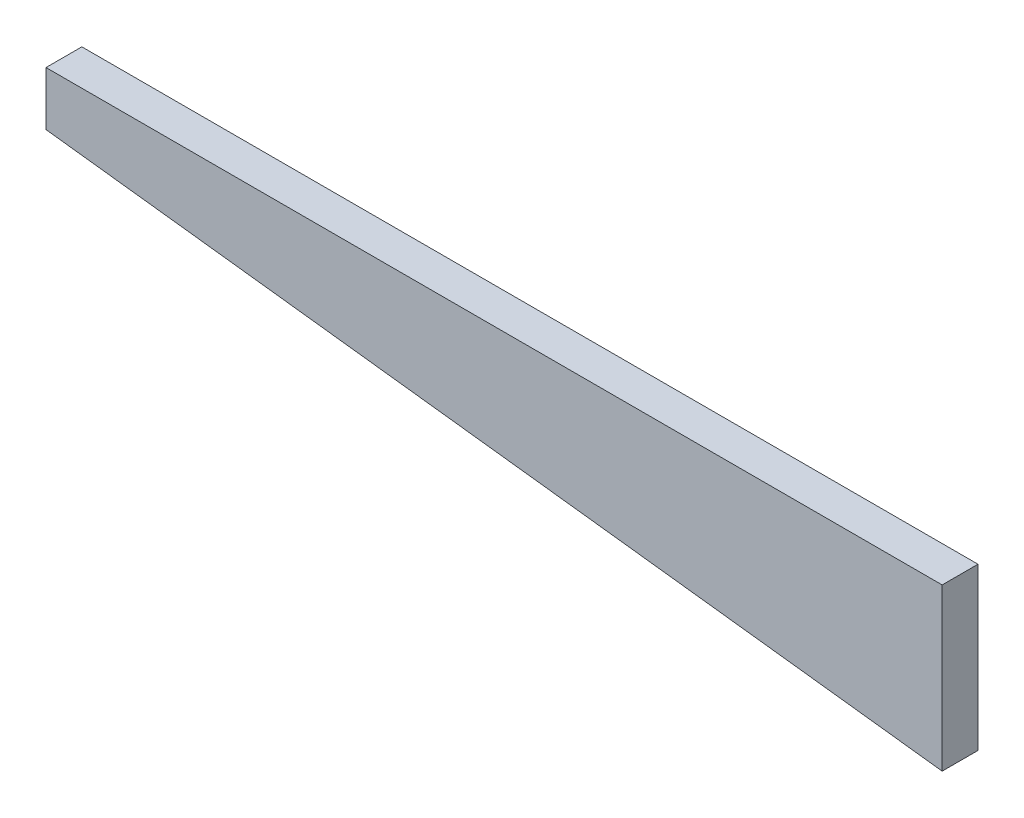
ISO-10303-21;
HEADER;
FILE_DESCRIPTION(('STEP AP214'),'2;1');
FILE_NAME('part.step','',(''),(''),'','','');
FILE_SCHEMA(('AUTOMOTIVE_DESIGN { 1 0 10303 214 1 1 1 1 }'));
ENDSEC;
DATA;
#1=APPLICATION_CONTEXT('core data for automotive mechanical design processes');
#2=APPLICATION_PROTOCOL_DEFINITION('international standard','automotive_design',2000,#1);
#3=PRODUCT_CONTEXT('',#1,'mechanical');
#4=PRODUCT('Part','Part','',(#3));
#5=PRODUCT_RELATED_PRODUCT_CATEGORY('part','',(#4));
#6=PRODUCT_DEFINITION_FORMATION('','',#4);
#7=PRODUCT_DEFINITION_CONTEXT('part definition',#1,'design');
#8=PRODUCT_DEFINITION('design','',#6,#7);
#9=PRODUCT_DEFINITION_SHAPE('','',#8);
#10=(LENGTH_UNIT() NAMED_UNIT(*) SI_UNIT(.MILLI.,.METRE.));
#11=(NAMED_UNIT(*) PLANE_ANGLE_UNIT() SI_UNIT($,.RADIAN.));
#12=(NAMED_UNIT(*) SI_UNIT($,.STERADIAN.) SOLID_ANGLE_UNIT());
#13=UNCERTAINTY_MEASURE_WITH_UNIT(LENGTH_MEASURE(1.E-05),#10,'distance_accuracy_value','');
#14=(GEOMETRIC_REPRESENTATION_CONTEXT(3) GLOBAL_UNCERTAINTY_ASSIGNED_CONTEXT((#13)) GLOBAL_UNIT_ASSIGNED_CONTEXT((#10,
#11,#12)) REPRESENTATION_CONTEXT('',''));
#15=CARTESIAN_POINT('',(0.,0.,0.));
#16=DIRECTION('',(0.,0.,1.));
#17=DIRECTION('',(1.,0.,0.));
#18=AXIS2_PLACEMENT_3D('',#15,#16,#17);
#19=CARTESIAN_POINT('',(-81.3443037974683,14.5398030942335,50.8));
#20=DIRECTION('',(-1.,0.,0.));
#21=DIRECTION('',(0.,-1.,0.));
#22=AXIS2_PLACEMENT_3D('',#19,#20,#21);
#23=PLANE('',#22);
#24=DIRECTION('',(0.,1.,0.));
#25=VECTOR('',#24,1.);
#26=CARTESIAN_POINT('',(-81.3443037974683,14.5398030942335,0.));
#27=LINE('',#26,#25);
#28=CARTESIAN_POINT('',(-81.3443037974675,-214.060196905767,0.));
#29=VERTEX_POINT('',#28);
#30=CARTESIAN_POINT('',(-81.3443037974683,14.5398030942335,0.));
#31=VERTEX_POINT('',#30);
#32=EDGE_CURVE('E105',#29,#31,#27,.T.);
#33=ORIENTED_EDGE('',*,*,#32,.T.);
#34=DIRECTION('',(0.,0.,-1.));
#35=VECTOR('',#34,1.);
#36=CARTESIAN_POINT('',(-81.3443037974683,14.5398030942335,50.8));
#37=LINE('',#36,#35);
#38=CARTESIAN_POINT('',(-81.3443037974683,14.5398030942335,50.8));
#39=VERTEX_POINT('',#38);
#40=EDGE_CURVE('E11',#39,#31,#37,.T.);
#41=ORIENTED_EDGE('',*,*,#40,.F.);
#42=DIRECTION('',(0.,1.,0.));
#43=VECTOR('',#42,1.);
#44=CARTESIAN_POINT('',(-81.3443037974683,14.5398030942335,50.8));
#45=LINE('',#44,#43);
#46=CARTESIAN_POINT('',(-81.3443037974675,-214.060196905767,50.8));
#47=VERTEX_POINT('',#46);
#48=EDGE_CURVE('E93',#47,#39,#45,.T.);
#49=ORIENTED_EDGE('',*,*,#48,.F.);
#50=DIRECTION('',(0.,0.,-1.));
#51=VECTOR('',#50,1.);
#52=CARTESIAN_POINT('',(-81.3443037974675,-214.060196905767,50.8));
#53=LINE('',#52,#51);
#54=EDGE_CURVE('E101',#47,#29,#53,.T.);
#55=ORIENTED_EDGE('',*,*,#54,.T.);
#56=EDGE_LOOP('',(#33,#41,#49,#55));
#57=FACE_BOUND('',#56,.T.);
#58=ADVANCED_FACE('F42',(#57),#23,.F.);
#59=CARTESIAN_POINT('',(-81.3443037974683,14.5398030942335,50.8));
#60=DIRECTION('',(0.,-1.,0.));
#61=DIRECTION('',(0.,0.,-1.));
#62=AXIS2_PLACEMENT_3D('',#59,#60,#61);
#63=PLANE('',#62);
#64=DIRECTION('',(-1.,0.,0.));
#65=VECTOR('',#64,1.);
#66=CARTESIAN_POINT('',(-81.3443037974683,14.5398030942335,0.));
#67=LINE('',#66,#65);
#68=CARTESIAN_POINT('',(-1351.34430379747,14.5398030942335,0.));
#69=VERTEX_POINT('',#68);
#70=EDGE_CURVE('E97',#31,#69,#67,.T.);
#71=ORIENTED_EDGE('',*,*,#70,.T.);
#72=DIRECTION('',(0.,0.,-1.));
#73=VECTOR('',#72,1.);
#74=CARTESIAN_POINT('',(-1351.34430379747,14.5398030942335,50.8));
#75=LINE('',#74,#73);
#76=CARTESIAN_POINT('',(-1351.34430379747,14.5398030942335,50.8));
#77=VERTEX_POINT('',#76);
#78=EDGE_CURVE('E50',#77,#69,#75,.T.);
#79=ORIENTED_EDGE('',*,*,#78,.F.);
#80=DIRECTION('',(-1.,0.,0.));
#81=VECTOR('',#80,1.);
#82=CARTESIAN_POINT('',(-81.3443037974683,14.5398030942335,50.8));
#83=LINE('',#82,#81);
#84=EDGE_CURVE('E88',#39,#77,#83,.T.);
#85=ORIENTED_EDGE('',*,*,#84,.F.);
#86=ORIENTED_EDGE('',*,*,#40,.T.);
#87=EDGE_LOOP('',(#71,#79,#85,#86));
#88=FACE_BOUND('',#87,.T.);
#89=ADVANCED_FACE('F96',(#88),#63,.F.);
#90=CARTESIAN_POINT('',(-1351.34430379747,14.5398030942335,50.8));
#91=DIRECTION('',(1.,0.,0.));
#92=DIRECTION('',(0.,1.,0.));
#93=AXIS2_PLACEMENT_3D('',#90,#91,#92);
#94=PLANE('',#93);
#95=DIRECTION('',(0.,-1.,0.));
#96=VECTOR('',#95,1.);
#97=CARTESIAN_POINT('',(-1351.34430379747,14.5398030942335,0.));
#98=LINE('',#97,#96);
#99=CARTESIAN_POINT('',(-1351.34430379747,-61.6601969057665,0.));
#100=VERTEX_POINT('',#99);
#101=EDGE_CURVE('E75',#69,#100,#98,.T.);
#102=ORIENTED_EDGE('',*,*,#101,.T.);
#103=DIRECTION('',(0.,0.,-1.));
#104=VECTOR('',#103,1.);
#105=CARTESIAN_POINT('',(-1351.34430379747,-61.6601969057665,50.8));
#106=LINE('',#105,#104);
#107=CARTESIAN_POINT('',(-1351.34430379747,-61.6601969057665,50.8));
#108=VERTEX_POINT('',#107);
#109=EDGE_CURVE('E98',#108,#100,#106,.T.);
#110=ORIENTED_EDGE('',*,*,#109,.F.);
#111=DIRECTION('',(0.,-1.,0.));
#112=VECTOR('',#111,1.);
#113=CARTESIAN_POINT('',(-1351.34430379747,14.5398030942335,50.8));
#114=LINE('',#113,#112);
#115=EDGE_CURVE('E91',#77,#108,#114,.T.);
#116=ORIENTED_EDGE('',*,*,#115,.F.);
#117=ORIENTED_EDGE('',*,*,#78,.T.);
#118=EDGE_LOOP('',(#102,#110,#116,#117));
#119=FACE_BOUND('',#118,.T.);
#120=ADVANCED_FACE('F99',(#119),#94,.F.);
#121=CARTESIAN_POINT('',(-1351.34430379747,-61.6601969057665,50.8));
#122=DIRECTION('',(0.119145220618431,0.992876838486922,0.));
#123=DIRECTION('',(-0.992876838486922,0.119145220618431,0.));
#124=AXIS2_PLACEMENT_3D('',#121,#122,#123);
#125=PLANE('',#124);
#126=DIRECTION('',(0.992876838486922,-0.119145220618431,0.));
#127=VECTOR('',#126,1.);
#128=CARTESIAN_POINT('',(-1351.34430379747,-61.6601969057665,0.));
#129=LINE('',#128,#127);
#130=EDGE_CURVE('E81',#100,#29,#129,.T.);
#131=ORIENTED_EDGE('',*,*,#130,.T.);
#132=ORIENTED_EDGE('',*,*,#54,.F.);
#133=DIRECTION('',(0.992876838486922,-0.119145220618431,0.));
#134=VECTOR('',#133,1.);
#135=CARTESIAN_POINT('',(-1351.34430379747,-61.6601969057665,50.8));
#136=LINE('',#135,#134);
#137=EDGE_CURVE('E58',#108,#47,#136,.T.);
#138=ORIENTED_EDGE('',*,*,#137,.F.);
#139=ORIENTED_EDGE('',*,*,#109,.T.);
#140=EDGE_LOOP('',(#131,#132,#138,#139));
#141=FACE_BOUND('',#140,.T.);
#142=ADVANCED_FACE('F112',(#141),#125,.F.);
#143=CARTESIAN_POINT('',(-81.3443037974683,14.5398030942335,50.8));
#144=DIRECTION('',(0.,0.,-1.));
#145=DIRECTION('',(-1.,0.,0.));
#146=AXIS2_PLACEMENT_3D('',#143,#144,#145);
#147=PLANE('',#146);
#148=ORIENTED_EDGE('',*,*,#48,.T.);
#149=ORIENTED_EDGE('',*,*,#84,.T.);
#150=ORIENTED_EDGE('',*,*,#115,.T.);
#151=ORIENTED_EDGE('',*,*,#137,.T.);
#152=EDGE_LOOP('',(#148,#149,#150,#151));
#153=FACE_BOUND('',#152,.T.);
#154=ADVANCED_FACE('F89',(#153),#147,.F.);
#155=CARTESIAN_POINT('',(-81.3443037974683,14.5398030942335,0.));
#156=DIRECTION('',(0.,0.,-1.));
#157=DIRECTION('',(-1.,0.,0.));
#158=AXIS2_PLACEMENT_3D('',#155,#156,#157);
#159=PLANE('',#158);
#160=ORIENTED_EDGE('',*,*,#32,.F.);
#161=ORIENTED_EDGE('',*,*,#130,.F.);
#162=ORIENTED_EDGE('',*,*,#101,.F.);
#163=ORIENTED_EDGE('',*,*,#70,.F.);
#164=EDGE_LOOP('',(#160,#161,#162,#163));
#165=FACE_BOUND('',#164,.T.);
#166=ADVANCED_FACE('F115',(#165),#159,.T.);
#167=CLOSED_SHELL('',(#58,#89,#120,#142,#154,#166));
#168=MANIFOLD_SOLID_BREP('B2',#167);
#169=ADVANCED_BREP_SHAPE_REPRESENTATION('',(#18,#168),#14);
#170=SHAPE_DEFINITION_REPRESENTATION(#9,#169);
ENDSEC;
END-ISO-10303-21;
